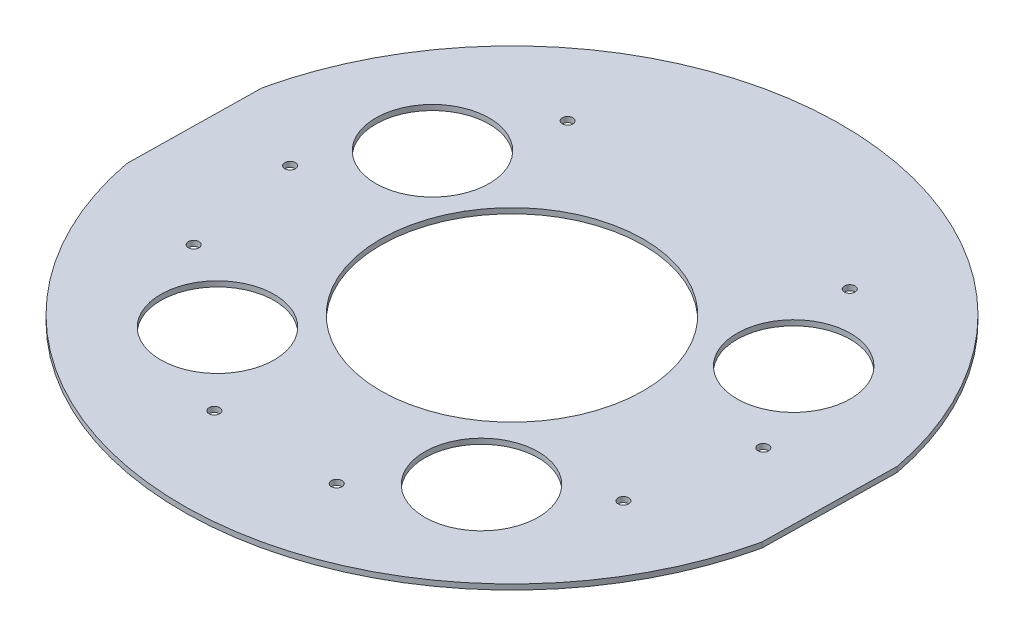
ISO-10303-21;
HEADER;
FILE_DESCRIPTION(('STEP AP214'),'2;1');
FILE_NAME('part.step','',(''),(''),'','','');
FILE_SCHEMA(('AUTOMOTIVE_DESIGN { 1 0 10303 214 1 1 1 1 }'));
ENDSEC;
DATA;
#1=APPLICATION_CONTEXT('core data for automotive mechanical design processes');
#2=APPLICATION_PROTOCOL_DEFINITION('international standard','automotive_design',2000,#1);
#3=PRODUCT_CONTEXT('',#1,'mechanical');
#4=PRODUCT('Part','Part','',(#3));
#5=PRODUCT_RELATED_PRODUCT_CATEGORY('part','',(#4));
#6=PRODUCT_DEFINITION_FORMATION('','',#4);
#7=PRODUCT_DEFINITION_CONTEXT('part definition',#1,'design');
#8=PRODUCT_DEFINITION('design','',#6,#7);
#9=PRODUCT_DEFINITION_SHAPE('','',#8);
#10=(LENGTH_UNIT() NAMED_UNIT(*) SI_UNIT(.MILLI.,.METRE.));
#11=(NAMED_UNIT(*) PLANE_ANGLE_UNIT() SI_UNIT($,.RADIAN.));
#12=(NAMED_UNIT(*) SI_UNIT($,.STERADIAN.) SOLID_ANGLE_UNIT());
#13=UNCERTAINTY_MEASURE_WITH_UNIT(LENGTH_MEASURE(1.E-05),#10,'distance_accuracy_value','');
#14=(GEOMETRIC_REPRESENTATION_CONTEXT(3) GLOBAL_UNCERTAINTY_ASSIGNED_CONTEXT((#13)) GLOBAL_UNIT_ASSIGNED_CONTEXT((#10,
#11,#12)) REPRESENTATION_CONTEXT('',''));
#15=CARTESIAN_POINT('',(0.,0.,0.));
#16=DIRECTION('',(0.,0.,1.));
#17=DIRECTION('',(1.,0.,0.));
#18=AXIS2_PLACEMENT_3D('',#15,#16,#17);
#19=CARTESIAN_POINT('',(44.1494076014619,1.,-2.9663860796645));
#20=DIRECTION('',(0.,1.,0.));
#21=DIRECTION('',(0.,0.,1.));
#22=AXIS2_PLACEMENT_3D('',#19,#20,#21);
#23=PLANE('',#22);
#24=CARTESIAN_POINT('',(84.8046077689851,1.00000000000003,16.7869604555201));
#25=DIRECTION('',(0.,1.,0.));
#26=DIRECTION('',(0.,0.,1.));
#27=AXIS2_PLACEMENT_3D('',#24,#25,#26);
#28=CIRCLE('',#27,1.0000000000648);
#29=CARTESIAN_POINT('',(84.8046077689851,1.00000000000003,17.7869604555849));
#30=VERTEX_POINT('',#29);
#31=EDGE_CURVE('E162',#30,#30,#28,.T.);
#32=ORIENTED_EDGE('',*,*,#31,.F.);
#33=EDGE_LOOP('',(#32));
#34=FACE_BOUND('',#33,.T.);
#35=CARTESIAN_POINT('',(89.3055621361475,1.00000000000003,-4.95678996822555));
#36=DIRECTION('',(0.,1.,0.));
#37=DIRECTION('',(0.,0.,1.));
#38=AXIS2_PLACEMENT_3D('',#35,#36,#37);
#39=CIRCLE('',#38,1.00000000000401);
#40=CARTESIAN_POINT('',(89.3055621361475,1.00000000000003,-3.95678996822154));
#41=VERTEX_POINT('',#40);
#42=EDGE_CURVE('E152',#41,#41,#39,.T.);
#43=ORIENTED_EDGE('',*,*,#42,.F.);
#44=EDGE_LOOP('',(#43));
#45=FACE_BOUND('',#44,.T.);
#46=CARTESIAN_POINT('',(71.6229373289079,1.00000000000003,-38.8585184252794));
#47=DIRECTION('',(0.,1.,0.));
#48=DIRECTION('',(0.,0.,1.));
#49=AXIS2_PLACEMENT_3D('',#46,#47,#48);
#50=CIRCLE('',#49,0.99999999997895);
#51=CARTESIAN_POINT('',(71.6229373289079,1.00000000000003,-37.8585184253005));
#52=VERTEX_POINT('',#51);
#53=EDGE_CURVE('E149',#52,#52,#50,.T.);
#54=ORIENTED_EDGE('',*,*,#53,.F.);
#55=EDGE_LOOP('',(#54));
#56=FACE_BOUND('',#55,.T.);
#57=CARTESIAN_POINT('',(17.8347378299426,1.00000000000003,-39.7165990697389));
#58=DIRECTION('',(0.,1.,0.));
#59=DIRECTION('',(0.,0.,1.));
#60=AXIS2_PLACEMENT_3D('',#57,#58,#59);
#61=CIRCLE('',#60,1.00000000003391);
#62=CARTESIAN_POINT('',(17.8347378299426,1.00000000000003,-38.716599069705));
#63=VERTEX_POINT('',#62);
#64=EDGE_CURVE('E146',#63,#63,#61,.T.);
#65=ORIENTED_EDGE('',*,*,#64,.F.);
#66=EDGE_LOOP('',(#65));
#67=FACE_BOUND('',#66,.T.);
#68=CARTESIAN_POINT('',(-0.920279110847903,1.00000000000003,-6.39615861646638));
#69=DIRECTION('',(0.,1.,0.));
#70=DIRECTION('',(0.,0.,1.));
#71=AXIS2_PLACEMENT_3D('',#68,#69,#70);
#72=CIRCLE('',#71,1.00000000003391);
#73=CARTESIAN_POINT('',(-0.920279110847903,1.00000000000003,-5.39615861643247));
#74=VERTEX_POINT('',#73);
#75=EDGE_CURVE('E142',#74,#74,#72,.T.);
#76=ORIENTED_EDGE('',*,*,#75,.F.);
#77=EDGE_LOOP('',(#76));
#78=FACE_BOUND('',#77,.T.);
#79=CARTESIAN_POINT('',(2.88480731815517,1.00000000000003,15.480097689839));
#80=DIRECTION('',(0.,1.,0.));
#81=DIRECTION('',(0.,0.,1.));
#82=AXIS2_PLACEMENT_3D('',#79,#80,#81);
#83=CIRCLE('',#82,1.00000000000778);
#84=CARTESIAN_POINT('',(2.88480731815517,1.00000000000003,16.4800976898468));
#85=VERTEX_POINT('',#84);
#86=EDGE_CURVE('E138',#85,#85,#83,.T.);
#87=ORIENTED_EDGE('',*,*,#86,.F.);
#88=EDGE_LOOP('',(#87));
#89=FACE_BOUND('',#88,.T.);
#90=CARTESIAN_POINT('',(31.7892373690993,1.00000000000003,40.5108055479779));
#91=DIRECTION('',(0.,1.,0.));
#92=DIRECTION('',(0.,0.,1.));
#93=AXIS2_PLACEMENT_3D('',#90,#91,#92);
#94=CIRCLE('',#93,1.00000000003986);
#95=CARTESIAN_POINT('',(31.7892373690993,1.00000000000003,41.5108055480178));
#96=VERTEX_POINT('',#95);
#97=EDGE_CURVE('E134',#96,#96,#94,.T.);
#98=ORIENTED_EDGE('',*,*,#97,.F.);
#99=EDGE_LOOP('',(#98));
#100=FACE_BOUND('',#99,.T.);
#101=CARTESIAN_POINT('',(55.1164619006442,1.00000000000003,40.8829436757486));
#102=DIRECTION('',(0.,1.,0.));
#103=DIRECTION('',(0.,0.,1.));
#104=AXIS2_PLACEMENT_3D('',#101,#102,#103);
#105=CIRCLE('',#104,1.00000000010046);
#106=CARTESIAN_POINT('',(55.1164619006442,1.00000000000003,41.8829436758491));
#107=VERTEX_POINT('',#106);
#108=EDGE_CURVE('E130',#107,#107,#105,.T.);
#109=ORIENTED_EDGE('',*,*,#108,.F.);
#110=EDGE_LOOP('',(#109));
#111=FACE_BOUND('',#110,.T.);
#112=CARTESIAN_POINT('',(78.8809077586488,1.,-21.081807157611));
#113=DIRECTION('',(0.,1.,0.));
#114=DIRECTION('',(0.,0.,1.));
#115=AXIS2_PLACEMENT_3D('',#112,#113,#114);
#116=CIRCLE('',#115,10.6499999999998);
#117=CARTESIAN_POINT('',(78.8809077586488,1.,-10.4318071576113));
#118=VERTEX_POINT('',#117);
#119=EDGE_CURVE('E126',#118,#118,#116,.T.);
#120=ORIENTED_EDGE('',*,*,#119,.F.);
#121=EDGE_LOOP('',(#120));
#122=FACE_BOUND('',#121,.T.);
#123=CARTESIAN_POINT('',(10.013422933147,1.,-22.1804469394779));
#124=DIRECTION('',(0.,1.,0.));
#125=DIRECTION('',(0.,0.,1.));
#126=AXIS2_PLACEMENT_3D('',#123,#124,#125);
#127=CIRCLE('',#126,10.6499999999989);
#128=CARTESIAN_POINT('',(10.013422933147,1.,-11.530446939479));
#129=VERTEX_POINT('',#128);
#130=EDGE_CURVE('E122',#129,#129,#127,.T.);
#131=ORIENTED_EDGE('',*,*,#130,.F.);
#132=EDGE_LOOP('',(#131));
#133=FACE_BOUND('',#132,.T.);
#134=CARTESIAN_POINT('',(18.5060533101946,1.,26.645502828215));
#135=DIRECTION('',(0.,1.,0.));
#136=DIRECTION('',(0.,0.,1.));
#137=AXIS2_PLACEMENT_3D('',#134,#135,#136);
#138=CIRCLE('',#137,10.6499999999992);
#139=CARTESIAN_POINT('',(18.5060533101946,1.,37.2955028282142));
#140=VERTEX_POINT('',#139);
#141=EDGE_CURVE('E118',#140,#140,#138,.T.);
#142=ORIENTED_EDGE('',*,*,#141,.F.);
#143=EDGE_LOOP('',(#142));
#144=FACE_BOUND('',#143,.T.);
#145=CARTESIAN_POINT('',(68.8351591275912,1.,27.4484007121276));
#146=DIRECTION('',(0.,1.,0.));
#147=DIRECTION('',(0.,0.,1.));
#148=AXIS2_PLACEMENT_3D('',#145,#146,#147);
#149=CIRCLE('',#148,10.6499999999984);
#150=CARTESIAN_POINT('',(68.8351591275912,1.,38.098400712126));
#151=VERTEX_POINT('',#150);
#152=EDGE_CURVE('E114',#151,#151,#149,.T.);
#153=ORIENTED_EDGE('',*,*,#152,.F.);
#154=EDGE_LOOP('',(#153));
#155=FACE_BOUND('',#154,.T.);
#156=CARTESIAN_POINT('',(44.1494076014619,1.,-2.9663860796645));
#157=DIRECTION('',(0.,1.,0.));
#158=DIRECTION('',(0.,0.,1.));
#159=AXIS2_PLACEMENT_3D('',#156,#157,#158);
#160=CIRCLE('',#159,61.8170061942194);
#161=CARTESIAN_POINT('',(-16.5822822087462,1.,8.56635460123314));
#162=VERTEX_POINT('',#161);
#163=CARTESIAN_POINT('',(104.482324314608,1.,10.4976926374543));
#164=VERTEX_POINT('',#163);
#165=EDGE_CURVE('E88',#162,#164,#160,.T.);
#166=ORIENTED_EDGE('',*,*,#165,.T.);
#167=DIRECTION('',(0.015950923882489,0.,-0.999872775920664));
#168=VECTOR('',#167,1.);
#169=CARTESIAN_POINT('',(104.482324314608,1.,10.4976926374543));
#170=LINE('',#169,#168);
#171=CARTESIAN_POINT('',(104.88109741167,1.,-14.4991267605623));
#172=VERTEX_POINT('',#171);
#173=EDGE_CURVE('E83',#164,#172,#170,.T.);
#174=ORIENTED_EDGE('',*,*,#173,.T.);
#175=CARTESIAN_POINT('',(44.1494076014619,1.,-2.9663860796645));
#176=DIRECTION('',(0.,1.,0.));
#177=DIRECTION('',(0.,0.,1.));
#178=AXIS2_PLACEMENT_3D('',#175,#176,#177);
#179=CIRCLE('',#178,61.8170061942196);
#180=CARTESIAN_POINT('',(-16.1835091116843,1.,-16.4304647967832));
#181=VERTEX_POINT('',#180);
#182=EDGE_CURVE('E86',#172,#181,#179,.T.);
#183=ORIENTED_EDGE('',*,*,#182,.T.);
#184=DIRECTION('',(-0.0159509238824743,0.,0.999872775920665));
#185=VECTOR('',#184,1.);
#186=CARTESIAN_POINT('',(-16.5822822087462,1.,8.56635460123314));
#187=LINE('',#186,#185);
#188=EDGE_CURVE('E53',#181,#162,#187,.T.);
#189=ORIENTED_EDGE('',*,*,#188,.T.);
#190=EDGE_LOOP('',(#166,#174,#183,#189));
#191=FACE_BOUND('',#190,.T.);
#192=CARTESIAN_POINT('',(44.1494076014619,1.,-2.9663860796645));
#193=DIRECTION('',(0.,1.,0.));
#194=DIRECTION('',(0.,0.,1.));
#195=AXIS2_PLACEMENT_3D('',#192,#193,#194);
#196=CIRCLE('',#195,24.6510000000029);
#197=CARTESIAN_POINT('',(44.1494076014619,1.,21.6846139203384));
#198=VERTEX_POINT('',#197);
#199=EDGE_CURVE('E104',#198,#198,#196,.T.);
#200=ORIENTED_EDGE('',*,*,#199,.F.);
#201=EDGE_LOOP('',(#200));
#202=FACE_BOUND('',#201,.T.);
#203=ADVANCED_FACE('F34',(#34,#45,#56,#67,#78,#89,#100,#111,#122,#133,#144,#155,#191,#202),#23,.T.);
#204=CARTESIAN_POINT('',(44.1494076014619,0.,-2.9663860796645));
#205=DIRECTION('',(0.,1.,0.));
#206=DIRECTION('',(0.,0.,1.));
#207=AXIS2_PLACEMENT_3D('',#204,#205,#206);
#208=PLANE('',#207);
#209=CARTESIAN_POINT('',(84.8046077689851,0.,16.7869604555201));
#210=DIRECTION('',(0.,1.,0.));
#211=DIRECTION('',(0.,0.,1.));
#212=AXIS2_PLACEMENT_3D('',#209,#210,#211);
#213=CIRCLE('',#212,1.0000000000648);
#214=CARTESIAN_POINT('',(84.8046077689851,0.,17.7869604555849));
#215=VERTEX_POINT('',#214);
#216=EDGE_CURVE('E38',#215,#215,#213,.T.);
#217=ORIENTED_EDGE('',*,*,#216,.T.);
#218=EDGE_LOOP('',(#217));
#219=FACE_BOUND('',#218,.T.);
#220=CARTESIAN_POINT('',(89.3055621361475,0.,-4.95678996822555));
#221=DIRECTION('',(0.,1.,0.));
#222=DIRECTION('',(0.,0.,1.));
#223=AXIS2_PLACEMENT_3D('',#220,#221,#222);
#224=CIRCLE('',#223,1.00000000000401);
#225=CARTESIAN_POINT('',(89.3055621361475,0.,-3.95678996822154));
#226=VERTEX_POINT('',#225);
#227=EDGE_CURVE('E150',#226,#226,#224,.T.);
#228=ORIENTED_EDGE('',*,*,#227,.T.);
#229=EDGE_LOOP('',(#228));
#230=FACE_BOUND('',#229,.T.);
#231=CARTESIAN_POINT('',(71.6229373289079,0.,-38.8585184252794));
#232=DIRECTION('',(0.,1.,0.));
#233=DIRECTION('',(0.,0.,1.));
#234=AXIS2_PLACEMENT_3D('',#231,#232,#233);
#235=CIRCLE('',#234,0.99999999997895);
#236=CARTESIAN_POINT('',(71.6229373289079,0.,-37.8585184253005));
#237=VERTEX_POINT('',#236);
#238=EDGE_CURVE('E147',#237,#237,#235,.T.);
#239=ORIENTED_EDGE('',*,*,#238,.T.);
#240=EDGE_LOOP('',(#239));
#241=FACE_BOUND('',#240,.T.);
#242=CARTESIAN_POINT('',(17.8347378299426,0.,-39.7165990697389));
#243=DIRECTION('',(0.,1.,0.));
#244=DIRECTION('',(0.,0.,1.));
#245=AXIS2_PLACEMENT_3D('',#242,#243,#244);
#246=CIRCLE('',#245,1.00000000003391);
#247=CARTESIAN_POINT('',(17.8347378299426,0.,-38.716599069705));
#248=VERTEX_POINT('',#247);
#249=EDGE_CURVE('E143',#248,#248,#246,.T.);
#250=ORIENTED_EDGE('',*,*,#249,.T.);
#251=EDGE_LOOP('',(#250));
#252=FACE_BOUND('',#251,.T.);
#253=CARTESIAN_POINT('',(-0.920279110847903,0.,-6.39615861646638));
#254=DIRECTION('',(0.,1.,0.));
#255=DIRECTION('',(0.,0.,1.));
#256=AXIS2_PLACEMENT_3D('',#253,#254,#255);
#257=CIRCLE('',#256,1.00000000003391);
#258=CARTESIAN_POINT('',(-0.920279110847903,0.,-5.39615861643247));
#259=VERTEX_POINT('',#258);
#260=EDGE_CURVE('E139',#259,#259,#257,.T.);
#261=ORIENTED_EDGE('',*,*,#260,.T.);
#262=EDGE_LOOP('',(#261));
#263=FACE_BOUND('',#262,.T.);
#264=CARTESIAN_POINT('',(2.88480731815517,0.,15.480097689839));
#265=DIRECTION('',(0.,1.,0.));
#266=DIRECTION('',(0.,0.,1.));
#267=AXIS2_PLACEMENT_3D('',#264,#265,#266);
#268=CIRCLE('',#267,1.00000000000778);
#269=CARTESIAN_POINT('',(2.88480731815517,0.,16.4800976898468));
#270=VERTEX_POINT('',#269);
#271=EDGE_CURVE('E135',#270,#270,#268,.T.);
#272=ORIENTED_EDGE('',*,*,#271,.T.);
#273=EDGE_LOOP('',(#272));
#274=FACE_BOUND('',#273,.T.);
#275=CARTESIAN_POINT('',(31.7892373690993,0.,40.5108055479779));
#276=DIRECTION('',(0.,1.,0.));
#277=DIRECTION('',(0.,0.,1.));
#278=AXIS2_PLACEMENT_3D('',#275,#276,#277);
#279=CIRCLE('',#278,1.00000000003986);
#280=CARTESIAN_POINT('',(31.7892373690993,0.,41.5108055480178));
#281=VERTEX_POINT('',#280);
#282=EDGE_CURVE('E131',#281,#281,#279,.T.);
#283=ORIENTED_EDGE('',*,*,#282,.T.);
#284=EDGE_LOOP('',(#283));
#285=FACE_BOUND('',#284,.T.);
#286=CARTESIAN_POINT('',(55.1164619006442,0.,40.8829436757486));
#287=DIRECTION('',(0.,1.,0.));
#288=DIRECTION('',(0.,0.,1.));
#289=AXIS2_PLACEMENT_3D('',#286,#287,#288);
#290=CIRCLE('',#289,1.00000000010046);
#291=CARTESIAN_POINT('',(55.1164619006442,0.,41.8829436758491));
#292=VERTEX_POINT('',#291);
#293=EDGE_CURVE('E127',#292,#292,#290,.T.);
#294=ORIENTED_EDGE('',*,*,#293,.T.);
#295=EDGE_LOOP('',(#294));
#296=FACE_BOUND('',#295,.T.);
#297=CARTESIAN_POINT('',(78.8809077586488,0.,-21.081807157611));
#298=DIRECTION('',(0.,1.,0.));
#299=DIRECTION('',(0.,0.,1.));
#300=AXIS2_PLACEMENT_3D('',#297,#298,#299);
#301=CIRCLE('',#300,10.6499999999998);
#302=CARTESIAN_POINT('',(78.8809077586488,0.,-10.4318071576113));
#303=VERTEX_POINT('',#302);
#304=EDGE_CURVE('E123',#303,#303,#301,.T.);
#305=ORIENTED_EDGE('',*,*,#304,.T.);
#306=EDGE_LOOP('',(#305));
#307=FACE_BOUND('',#306,.T.);
#308=CARTESIAN_POINT('',(10.013422933147,0.,-22.1804469394779));
#309=DIRECTION('',(0.,1.,0.));
#310=DIRECTION('',(0.,0.,1.));
#311=AXIS2_PLACEMENT_3D('',#308,#309,#310);
#312=CIRCLE('',#311,10.6499999999989);
#313=CARTESIAN_POINT('',(10.013422933147,0.,-11.530446939479));
#314=VERTEX_POINT('',#313);
#315=EDGE_CURVE('E119',#314,#314,#312,.T.);
#316=ORIENTED_EDGE('',*,*,#315,.T.);
#317=EDGE_LOOP('',(#316));
#318=FACE_BOUND('',#317,.T.);
#319=CARTESIAN_POINT('',(18.5060533101946,0.,26.645502828215));
#320=DIRECTION('',(0.,1.,0.));
#321=DIRECTION('',(0.,0.,1.));
#322=AXIS2_PLACEMENT_3D('',#319,#320,#321);
#323=CIRCLE('',#322,10.6499999999992);
#324=CARTESIAN_POINT('',(18.5060533101946,0.,37.2955028282142));
#325=VERTEX_POINT('',#324);
#326=EDGE_CURVE('E115',#325,#325,#323,.T.);
#327=ORIENTED_EDGE('',*,*,#326,.T.);
#328=EDGE_LOOP('',(#327));
#329=FACE_BOUND('',#328,.T.);
#330=CARTESIAN_POINT('',(68.8351591275912,0.,27.4484007121276));
#331=DIRECTION('',(0.,1.,0.));
#332=DIRECTION('',(0.,0.,1.));
#333=AXIS2_PLACEMENT_3D('',#330,#331,#332);
#334=CIRCLE('',#333,10.6499999999984);
#335=CARTESIAN_POINT('',(68.8351591275912,0.,38.098400712126));
#336=VERTEX_POINT('',#335);
#337=EDGE_CURVE('E110',#336,#336,#334,.T.);
#338=ORIENTED_EDGE('',*,*,#337,.T.);
#339=EDGE_LOOP('',(#338));
#340=FACE_BOUND('',#339,.T.);
#341=CARTESIAN_POINT('',(44.1494076014619,0.,-2.9663860796645));
#342=DIRECTION('',(0.,1.,0.));
#343=DIRECTION('',(0.,0.,1.));
#344=AXIS2_PLACEMENT_3D('',#341,#342,#343);
#345=CIRCLE('',#344,61.8170061942194);
#346=CARTESIAN_POINT('',(-16.5822822087462,0.,8.56635460123314));
#347=VERTEX_POINT('',#346);
#348=CARTESIAN_POINT('',(104.482324314608,0.,10.4976926374543));
#349=VERTEX_POINT('',#348);
#350=EDGE_CURVE('E101',#347,#349,#345,.T.);
#351=ORIENTED_EDGE('',*,*,#350,.F.);
#352=DIRECTION('',(-0.0159509238824743,0.,0.999872775920665));
#353=VECTOR('',#352,1.);
#354=CARTESIAN_POINT('',(-16.5822822087462,0.,8.56635460123314));
#355=LINE('',#354,#353);
#356=CARTESIAN_POINT('',(-16.1835091116843,0.,-16.4304647967832));
#357=VERTEX_POINT('',#356);
#358=EDGE_CURVE('E76',#357,#347,#355,.T.);
#359=ORIENTED_EDGE('',*,*,#358,.F.);
#360=CARTESIAN_POINT('',(44.1494076014619,0.,-2.9663860796645));
#361=DIRECTION('',(0.,1.,0.));
#362=DIRECTION('',(0.,0.,1.));
#363=AXIS2_PLACEMENT_3D('',#360,#361,#362);
#364=CIRCLE('',#363,61.8170061942196);
#365=CARTESIAN_POINT('',(104.88109741167,0.,-14.4991267605623));
#366=VERTEX_POINT('',#365);
#367=EDGE_CURVE('E70',#366,#357,#364,.T.);
#368=ORIENTED_EDGE('',*,*,#367,.F.);
#369=DIRECTION('',(0.015950923882489,0.,-0.999872775920664));
#370=VECTOR('',#369,1.);
#371=CARTESIAN_POINT('',(104.482324314608,0.,10.4976926374543));
#372=LINE('',#371,#370);
#373=EDGE_CURVE('E92',#349,#366,#372,.T.);
#374=ORIENTED_EDGE('',*,*,#373,.F.);
#375=EDGE_LOOP('',(#351,#359,#368,#374));
#376=FACE_BOUND('',#375,.T.);
#377=CARTESIAN_POINT('',(44.1494076014619,0.,-2.9663860796645));
#378=DIRECTION('',(0.,1.,0.));
#379=DIRECTION('',(0.,0.,1.));
#380=AXIS2_PLACEMENT_3D('',#377,#378,#379);
#381=CIRCLE('',#380,24.6510000000029);
#382=CARTESIAN_POINT('',(44.1494076014619,0.,21.6846139203384));
#383=VERTEX_POINT('',#382);
#384=EDGE_CURVE('E113',#383,#383,#381,.T.);
#385=ORIENTED_EDGE('',*,*,#384,.T.);
#386=EDGE_LOOP('',(#385));
#387=FACE_BOUND('',#386,.T.);
#388=ADVANCED_FACE('F188',(#219,#230,#241,#252,#263,#274,#285,#296,#307,#318,#329,#340,#376,
#387),#208,.F.);
#389=CARTESIAN_POINT('',(44.1494076014619,1.,-2.9663860796645));
#390=DIRECTION('',(0.,-1.,0.));
#391=DIRECTION('',(0.,0.,-1.));
#392=AXIS2_PLACEMENT_3D('',#389,#390,#391);
#393=CYLINDRICAL_SURFACE('',#392,61.8170061942194);
#394=ORIENTED_EDGE('',*,*,#350,.T.);
#395=DIRECTION('',(0.,-1.,0.));
#396=VECTOR('',#395,1.);
#397=CARTESIAN_POINT('',(104.482324314608,1.,10.4976926374543));
#398=LINE('',#397,#396);
#399=EDGE_CURVE('E11',#164,#349,#398,.T.);
#400=ORIENTED_EDGE('',*,*,#399,.F.);
#401=ORIENTED_EDGE('',*,*,#165,.F.);
#402=DIRECTION('',(0.,-1.,0.));
#403=VECTOR('',#402,1.);
#404=CARTESIAN_POINT('',(-16.5822822087462,1.,8.56635460123314));
#405=LINE('',#404,#403);
#406=EDGE_CURVE('E97',#162,#347,#405,.T.);
#407=ORIENTED_EDGE('',*,*,#406,.T.);
#408=EDGE_LOOP('',(#394,#400,#401,#407));
#409=FACE_BOUND('',#408,.T.);
#410=ADVANCED_FACE('F36',(#409),#393,.T.);
#411=CARTESIAN_POINT('',(104.482324314608,1.,10.4976926374543));
#412=DIRECTION('',(-0.999872775920664,0.,-0.015950923882489));
#413=DIRECTION('',(-0.015950923882489,0.,0.999872775920664));
#414=AXIS2_PLACEMENT_3D('',#411,#412,#413);
#415=PLANE('',#414);
#416=ORIENTED_EDGE('',*,*,#373,.T.);
#417=DIRECTION('',(0.,-1.,0.));
#418=VECTOR('',#417,1.);
#419=CARTESIAN_POINT('',(104.88109741167,1.,-14.4991267605623));
#420=LINE('',#419,#418);
#421=EDGE_CURVE('E44',#172,#366,#420,.T.);
#422=ORIENTED_EDGE('',*,*,#421,.F.);
#423=ORIENTED_EDGE('',*,*,#173,.F.);
#424=ORIENTED_EDGE('',*,*,#399,.T.);
#425=EDGE_LOOP('',(#416,#422,#423,#424));
#426=FACE_BOUND('',#425,.T.);
#427=ADVANCED_FACE('F91',(#426),#415,.F.);
#428=CARTESIAN_POINT('',(44.1494076014619,1.,-2.9663860796645));
#429=DIRECTION('',(0.,-1.,0.));
#430=DIRECTION('',(0.,0.,-1.));
#431=AXIS2_PLACEMENT_3D('',#428,#429,#430);
#432=CYLINDRICAL_SURFACE('',#431,61.8170061942196);
#433=ORIENTED_EDGE('',*,*,#367,.T.);
#434=DIRECTION('',(0.,-1.,0.));
#435=VECTOR('',#434,1.);
#436=CARTESIAN_POINT('',(-16.1835091116843,1.,-16.4304647967832));
#437=LINE('',#436,#435);
#438=EDGE_CURVE('E93',#181,#357,#437,.T.);
#439=ORIENTED_EDGE('',*,*,#438,.F.);
#440=ORIENTED_EDGE('',*,*,#182,.F.);
#441=ORIENTED_EDGE('',*,*,#421,.T.);
#442=EDGE_LOOP('',(#433,#439,#440,#441));
#443=FACE_BOUND('',#442,.T.);
#444=ADVANCED_FACE('F95',(#443),#432,.T.);
#445=CARTESIAN_POINT('',(-16.5822822087462,1.,8.56635460123314));
#446=DIRECTION('',(0.999872775920665,0.,0.0159509238824743));
#447=DIRECTION('',(0.0159509238824743,0.,-0.999872775920665));
#448=AXIS2_PLACEMENT_3D('',#445,#446,#447);
#449=PLANE('',#448);
#450=ORIENTED_EDGE('',*,*,#358,.T.);
#451=ORIENTED_EDGE('',*,*,#406,.F.);
#452=ORIENTED_EDGE('',*,*,#188,.F.);
#453=ORIENTED_EDGE('',*,*,#438,.T.);
#454=EDGE_LOOP('',(#450,#451,#452,#453));
#455=FACE_BOUND('',#454,.T.);
#456=ADVANCED_FACE('F193',(#455),#449,.F.);
#457=CARTESIAN_POINT('',(44.1494076014619,1.,-2.9663860796645));
#458=DIRECTION('',(0.,-1.,0.));
#459=DIRECTION('',(0.,0.,-1.));
#460=AXIS2_PLACEMENT_3D('',#457,#458,#459);
#461=CYLINDRICAL_SURFACE('',#460,24.6510000000029);
#462=ORIENTED_EDGE('',*,*,#199,.T.);
#463=EDGE_LOOP('',(#462));
#464=FACE_BOUND('',#463,.T.);
#465=ORIENTED_EDGE('',*,*,#384,.F.);
#466=EDGE_LOOP('',(#465));
#467=FACE_BOUND('',#466,.T.);
#468=ADVANCED_FACE('F190',(#464,#467),#461,.F.);
#469=CARTESIAN_POINT('',(68.8351591275912,-9.,27.4484007121276));
#470=DIRECTION('',(0.,1.,0.));
#471=DIRECTION('',(0.,0.,1.));
#472=AXIS2_PLACEMENT_3D('',#469,#470,#471);
#473=CYLINDRICAL_SURFACE('',#472,10.6499999999984);
#474=ORIENTED_EDGE('',*,*,#152,.T.);
#475=EDGE_LOOP('',(#474));
#476=FACE_BOUND('',#475,.T.);
#477=ORIENTED_EDGE('',*,*,#337,.F.);
#478=EDGE_LOOP('',(#477));
#479=FACE_BOUND('',#478,.T.);
#480=ADVANCED_FACE('F192',(#476,#479),#473,.F.);
#481=CARTESIAN_POINT('',(18.5060533101946,-9.,26.645502828215));
#482=DIRECTION('',(0.,1.,0.));
#483=DIRECTION('',(0.,0.,1.));
#484=AXIS2_PLACEMENT_3D('',#481,#482,#483);
#485=CYLINDRICAL_SURFACE('',#484,10.6499999999992);
#486=ORIENTED_EDGE('',*,*,#141,.T.);
#487=EDGE_LOOP('',(#486));
#488=FACE_BOUND('',#487,.T.);
#489=ORIENTED_EDGE('',*,*,#326,.F.);
#490=EDGE_LOOP('',(#489));
#491=FACE_BOUND('',#490,.T.);
#492=ADVANCED_FACE('F200',(#488,#491),#485,.F.);
#493=CARTESIAN_POINT('',(10.013422933147,-9.,-22.1804469394779));
#494=DIRECTION('',(0.,1.,0.));
#495=DIRECTION('',(0.,0.,1.));
#496=AXIS2_PLACEMENT_3D('',#493,#494,#495);
#497=CYLINDRICAL_SURFACE('',#496,10.6499999999989);
#498=ORIENTED_EDGE('',*,*,#130,.T.);
#499=EDGE_LOOP('',(#498));
#500=FACE_BOUND('',#499,.T.);
#501=ORIENTED_EDGE('',*,*,#315,.F.);
#502=EDGE_LOOP('',(#501));
#503=FACE_BOUND('',#502,.T.);
#504=ADVANCED_FACE('F322',(#500,#503),#497,.F.);
#505=CARTESIAN_POINT('',(78.8809077586488,-9.,-21.081807157611));
#506=DIRECTION('',(0.,1.,0.));
#507=DIRECTION('',(0.,0.,1.));
#508=AXIS2_PLACEMENT_3D('',#505,#506,#507);
#509=CYLINDRICAL_SURFACE('',#508,10.6499999999998);
#510=ORIENTED_EDGE('',*,*,#119,.T.);
#511=EDGE_LOOP('',(#510));
#512=FACE_BOUND('',#511,.T.);
#513=ORIENTED_EDGE('',*,*,#304,.F.);
#514=EDGE_LOOP('',(#513));
#515=FACE_BOUND('',#514,.T.);
#516=ADVANCED_FACE('F243',(#512,#515),#509,.F.);
#517=CARTESIAN_POINT('',(55.1164619006442,-11.,40.8829436757486));
#518=DIRECTION('',(0.,1.,0.));
#519=DIRECTION('',(0.,0.,1.));
#520=AXIS2_PLACEMENT_3D('',#517,#518,#519);
#521=CYLINDRICAL_SURFACE('',#520,1.00000000010046);
#522=ORIENTED_EDGE('',*,*,#108,.T.);
#523=EDGE_LOOP('',(#522));
#524=FACE_BOUND('',#523,.T.);
#525=ORIENTED_EDGE('',*,*,#293,.F.);
#526=EDGE_LOOP('',(#525));
#527=FACE_BOUND('',#526,.T.);
#528=ADVANCED_FACE('F237',(#524,#527),#521,.F.);
#529=CARTESIAN_POINT('',(31.7892373690993,-11.,40.5108055479779));
#530=DIRECTION('',(0.,1.,0.));
#531=DIRECTION('',(0.,0.,1.));
#532=AXIS2_PLACEMENT_3D('',#529,#530,#531);
#533=CYLINDRICAL_SURFACE('',#532,1.00000000003986);
#534=ORIENTED_EDGE('',*,*,#97,.T.);
#535=EDGE_LOOP('',(#534));
#536=FACE_BOUND('',#535,.T.);
#537=ORIENTED_EDGE('',*,*,#282,.F.);
#538=EDGE_LOOP('',(#537));
#539=FACE_BOUND('',#538,.T.);
#540=ADVANCED_FACE('F242',(#536,#539),#533,.F.);
#541=CARTESIAN_POINT('',(2.88480731815517,-11.,15.480097689839));
#542=DIRECTION('',(0.,1.,0.));
#543=DIRECTION('',(0.,0.,1.));
#544=AXIS2_PLACEMENT_3D('',#541,#542,#543);
#545=CYLINDRICAL_SURFACE('',#544,1.00000000000778);
#546=ORIENTED_EDGE('',*,*,#86,.T.);
#547=EDGE_LOOP('',(#546));
#548=FACE_BOUND('',#547,.T.);
#549=ORIENTED_EDGE('',*,*,#271,.F.);
#550=EDGE_LOOP('',(#549));
#551=FACE_BOUND('',#550,.T.);
#552=ADVANCED_FACE('F255',(#548,#551),#545,.F.);
#553=CARTESIAN_POINT('',(-0.920279110847903,-11.,-6.39615861646638));
#554=DIRECTION('',(0.,1.,0.));
#555=DIRECTION('',(0.,0.,1.));
#556=AXIS2_PLACEMENT_3D('',#553,#554,#555);
#557=CYLINDRICAL_SURFACE('',#556,1.00000000003391);
#558=ORIENTED_EDGE('',*,*,#75,.T.);
#559=EDGE_LOOP('',(#558));
#560=FACE_BOUND('',#559,.T.);
#561=ORIENTED_EDGE('',*,*,#260,.F.);
#562=EDGE_LOOP('',(#561));
#563=FACE_BOUND('',#562,.T.);
#564=ADVANCED_FACE('F265',(#560,#563),#557,.F.);
#565=CARTESIAN_POINT('',(17.8347378299426,-11.,-39.7165990697389));
#566=DIRECTION('',(0.,1.,0.));
#567=DIRECTION('',(0.,0.,1.));
#568=AXIS2_PLACEMENT_3D('',#565,#566,#567);
#569=CYLINDRICAL_SURFACE('',#568,1.00000000003391);
#570=ORIENTED_EDGE('',*,*,#64,.T.);
#571=EDGE_LOOP('',(#570));
#572=FACE_BOUND('',#571,.T.);
#573=ORIENTED_EDGE('',*,*,#249,.F.);
#574=EDGE_LOOP('',(#573));
#575=FACE_BOUND('',#574,.T.);
#576=ADVANCED_FACE('F275',(#572,#575),#569,.F.);
#577=CARTESIAN_POINT('',(71.6229373289079,-11.,-38.8585184252794));
#578=DIRECTION('',(0.,1.,0.));
#579=DIRECTION('',(0.,0.,1.));
#580=AXIS2_PLACEMENT_3D('',#577,#578,#579);
#581=CYLINDRICAL_SURFACE('',#580,0.99999999997895);
#582=ORIENTED_EDGE('',*,*,#53,.T.);
#583=EDGE_LOOP('',(#582));
#584=FACE_BOUND('',#583,.T.);
#585=ORIENTED_EDGE('',*,*,#238,.F.);
#586=EDGE_LOOP('',(#585));
#587=FACE_BOUND('',#586,.T.);
#588=ADVANCED_FACE('F285',(#584,#587),#581,.F.);
#589=CARTESIAN_POINT('',(89.3055621361475,-11.,-4.95678996822555));
#590=DIRECTION('',(0.,1.,0.));
#591=DIRECTION('',(0.,0.,1.));
#592=AXIS2_PLACEMENT_3D('',#589,#590,#591);
#593=CYLINDRICAL_SURFACE('',#592,1.00000000000401);
#594=ORIENTED_EDGE('',*,*,#42,.T.);
#595=EDGE_LOOP('',(#594));
#596=FACE_BOUND('',#595,.T.);
#597=ORIENTED_EDGE('',*,*,#227,.F.);
#598=EDGE_LOOP('',(#597));
#599=FACE_BOUND('',#598,.T.);
#600=ADVANCED_FACE('F295',(#596,#599),#593,.F.);
#601=CARTESIAN_POINT('',(84.8046077689851,-11.,16.7869604555201));
#602=DIRECTION('',(0.,1.,0.));
#603=DIRECTION('',(0.,0.,1.));
#604=AXIS2_PLACEMENT_3D('',#601,#602,#603);
#605=CYLINDRICAL_SURFACE('',#604,1.0000000000648);
#606=ORIENTED_EDGE('',*,*,#31,.T.);
#607=EDGE_LOOP('',(#606));
#608=FACE_BOUND('',#607,.T.);
#609=ORIENTED_EDGE('',*,*,#216,.F.);
#610=EDGE_LOOP('',(#609));
#611=FACE_BOUND('',#610,.T.);
#612=ADVANCED_FACE('F305',(#608,#611),#605,.F.);
#613=CLOSED_SHELL('',(#203,#388,#410,#427,#444,#456,#468,#480,#492,#504,#516,#528,#540,#552,
#564,#576,#588,#600,#612));
#614=MANIFOLD_SOLID_BREP('B2',#613);
#615=ADVANCED_BREP_SHAPE_REPRESENTATION('',(#18,#614),#14);
#616=SHAPE_DEFINITION_REPRESENTATION(#9,#615);
ENDSEC;
END-ISO-10303-21;
